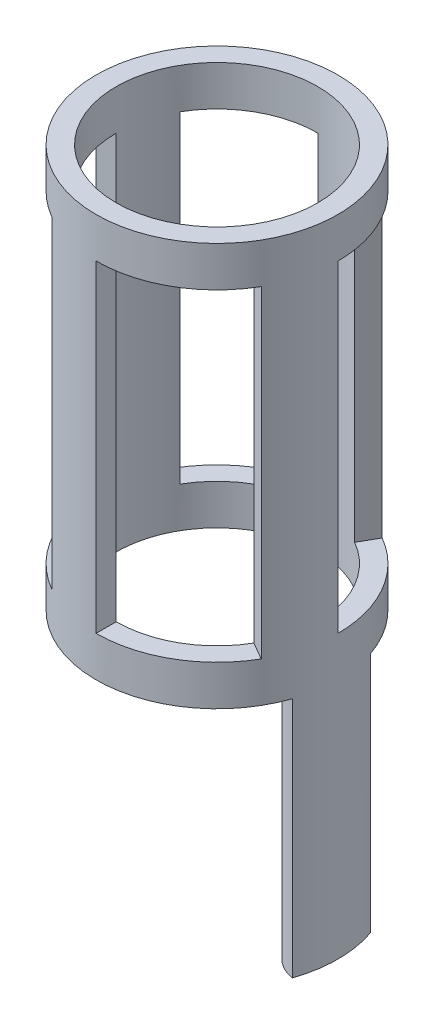
ISO-10303-21;
HEADER;
FILE_DESCRIPTION(('STEP AP214'),'2;1');
FILE_NAME('part.step','',(''),(''),'','','');
FILE_SCHEMA(('AUTOMOTIVE_DESIGN { 1 0 10303 214 1 1 1 1 }'));
ENDSEC;
DATA;
#1=APPLICATION_CONTEXT('core data for automotive mechanical design processes');
#2=APPLICATION_PROTOCOL_DEFINITION('international standard','automotive_design',2000,#1);
#3=PRODUCT_CONTEXT('',#1,'mechanical');
#4=PRODUCT('Part','Part','',(#3));
#5=PRODUCT_RELATED_PRODUCT_CATEGORY('part','',(#4));
#6=PRODUCT_DEFINITION_FORMATION('','',#4);
#7=PRODUCT_DEFINITION_CONTEXT('part definition',#1,'design');
#8=PRODUCT_DEFINITION('design','',#6,#7);
#9=PRODUCT_DEFINITION_SHAPE('','',#8);
#10=(LENGTH_UNIT() NAMED_UNIT(*) SI_UNIT(.MILLI.,.METRE.));
#11=(NAMED_UNIT(*) PLANE_ANGLE_UNIT() SI_UNIT($,.RADIAN.));
#12=(NAMED_UNIT(*) SI_UNIT($,.STERADIAN.) SOLID_ANGLE_UNIT());
#13=UNCERTAINTY_MEASURE_WITH_UNIT(LENGTH_MEASURE(1.E-05),#10,'distance_accuracy_value','');
#14=(GEOMETRIC_REPRESENTATION_CONTEXT(3) GLOBAL_UNCERTAINTY_ASSIGNED_CONTEXT((#13)) GLOBAL_UNIT_ASSIGNED_CONTEXT((#10,
#11,#12)) REPRESENTATION_CONTEXT('',''));
#15=CARTESIAN_POINT('',(0.,0.,0.));
#16=DIRECTION('',(0.,0.,1.));
#17=DIRECTION('',(1.,0.,0.));
#18=AXIS2_PLACEMENT_3D('',#15,#16,#17);
#19=CARTESIAN_POINT('',(0.,0.,0.));
#20=DIRECTION('',(0.,1.,0.));
#21=DIRECTION('',(0.,0.,1.));
#22=AXIS2_PLACEMENT_3D('',#19,#20,#21);
#23=PLANE('',#22);
#24=CARTESIAN_POINT('',(0.,0.,0.));
#25=DIRECTION('',(0.,-1.,0.));
#26=DIRECTION('',(0.,0.,-1.));
#27=AXIS2_PLACEMENT_3D('',#24,#25,#26);
#28=CIRCLE('',#27,35.6);
#29=CARTESIAN_POINT('',(34.3696850393701,0.,-9.27818679993567));
#30=VERTEX_POINT('',#29);
#31=CARTESIAN_POINT('',(34.3696850393701,0.,9.27818679993567));
#32=VERTEX_POINT('',#31);
#33=EDGE_CURVE('E51',#30,#32,#28,.T.);
#34=ORIENTED_EDGE('',*,*,#33,.T.);
#35=CARTESIAN_POINT('',(38.1,0.,0.));
#36=DIRECTION('',(0.,-1.,0.));
#37=DIRECTION('',(0.,0.,-1.));
#38=AXIS2_PLACEMENT_3D('',#35,#36,#37);
#39=CIRCLE('',#38,10.);
#40=CARTESIAN_POINT('',(30.9668307086614,0.,7.00841607362921));
#41=VERTEX_POINT('',#40);
#42=EDGE_CURVE('E44',#32,#41,#39,.T.);
#43=ORIENTED_EDGE('',*,*,#42,.T.);
#44=CARTESIAN_POINT('',(0.,0.,0.));
#45=DIRECTION('',(0.,1.,0.));
#46=DIRECTION('',(0.,0.,1.));
#47=AXIS2_PLACEMENT_3D('',#44,#45,#46);
#48=CIRCLE('',#47,31.75);
#49=CARTESIAN_POINT('',(30.9668307086614,0.,-7.00841607362921));
#50=VERTEX_POINT('',#49);
#51=EDGE_CURVE('E327',#41,#50,#48,.T.);
#52=ORIENTED_EDGE('',*,*,#51,.T.);
#53=EDGE_CURVE('E11',#50,#30,#39,.T.);
#54=ORIENTED_EDGE('',*,*,#53,.T.);
#55=EDGE_LOOP('',(#34,#43,#52,#54));
#56=FACE_BOUND('',#55,.T.);
#57=ADVANCED_FACE('F33',(#56),#23,.F.);
#58=CARTESIAN_POINT('',(0.,127.,0.));
#59=DIRECTION('',(0.866025403784438,0.,0.5));
#60=DIRECTION('',(0.5,0.,-0.866025403784438));
#61=AXIS2_PLACEMENT_3D('',#58,#59,#60);
#62=PLANE('',#61);
#63=DIRECTION('',(-0.5,0.,0.866025403784438));
#64=VECTOR('',#63,1.);
#65=CARTESIAN_POINT('',(0.,114.3,0.));
#66=LINE('',#65,#64);
#67=CARTESIAN_POINT('',(-15.875,114.3,27.4963065701559));
#68=VERTEX_POINT('',#67);
#69=CARTESIAN_POINT('',(-19.0500000000001,114.3,32.9955678841871));
#70=VERTEX_POINT('',#69);
#71=EDGE_CURVE('E247',#68,#70,#66,.T.);
#72=ORIENTED_EDGE('',*,*,#71,.F.);
#73=DIRECTION('',(0.,-1.,0.));
#74=VECTOR('',#73,1.);
#75=CARTESIAN_POINT('',(-15.875,127.,27.4963065701559));
#76=LINE('',#75,#74);
#77=CARTESIAN_POINT('',(-15.875,12.7,27.4963065701559));
#78=VERTEX_POINT('',#77);
#79=EDGE_CURVE('E304',#68,#78,#76,.T.);
#80=ORIENTED_EDGE('',*,*,#79,.T.);
#81=DIRECTION('',(0.5,0.,-0.866025403784438));
#82=VECTOR('',#81,1.);
#83=CARTESIAN_POINT('',(0.,12.7,0.));
#84=LINE('',#83,#82);
#85=CARTESIAN_POINT('',(-19.0500000000001,12.7,32.9955678841871));
#86=VERTEX_POINT('',#85);
#87=EDGE_CURVE('E309',#86,#78,#84,.T.);
#88=ORIENTED_EDGE('',*,*,#87,.F.);
#89=DIRECTION('',(0.,-1.,0.));
#90=VECTOR('',#89,1.);
#91=CARTESIAN_POINT('',(-19.0500000000001,127.,32.9955678841871));
#92=LINE('',#91,#90);
#93=EDGE_CURVE('E302',#70,#86,#92,.T.);
#94=ORIENTED_EDGE('',*,*,#93,.F.);
#95=EDGE_LOOP('',(#72,#80,#88,#94));
#96=FACE_BOUND('',#95,.T.);
#97=ADVANCED_FACE('F365',(#96),#62,.F.);
#98=CARTESIAN_POINT('',(0.,127.,0.));
#99=DIRECTION('',(-1.,0.,0.));
#100=DIRECTION('',(0.,0.,1.));
#101=AXIS2_PLACEMENT_3D('',#98,#99,#100);
#102=PLANE('',#101);
#103=DIRECTION('',(0.,0.,-1.));
#104=VECTOR('',#103,1.);
#105=CARTESIAN_POINT('',(0.,114.3,0.));
#106=LINE('',#105,#104);
#107=CARTESIAN_POINT('',(0.,114.3,38.1));
#108=VERTEX_POINT('',#107);
#109=CARTESIAN_POINT('',(0.,114.3,31.75));
#110=VERTEX_POINT('',#109);
#111=EDGE_CURVE('E244',#108,#110,#106,.T.);
#112=ORIENTED_EDGE('',*,*,#111,.F.);
#113=DIRECTION('',(0.,-1.,0.));
#114=VECTOR('',#113,1.);
#115=CARTESIAN_POINT('',(0.,127.,38.1));
#116=LINE('',#115,#114);
#117=CARTESIAN_POINT('',(0.,12.7,38.1));
#118=VERTEX_POINT('',#117);
#119=EDGE_CURVE('E300',#108,#118,#116,.T.);
#120=ORIENTED_EDGE('',*,*,#119,.T.);
#121=DIRECTION('',(0.,0.,1.));
#122=VECTOR('',#121,1.);
#123=CARTESIAN_POINT('',(0.,12.7,0.));
#124=LINE('',#123,#122);
#125=CARTESIAN_POINT('',(0.,12.7,31.75));
#126=VERTEX_POINT('',#125);
#127=EDGE_CURVE('E306',#126,#118,#124,.T.);
#128=ORIENTED_EDGE('',*,*,#127,.F.);
#129=DIRECTION('',(0.,-1.,0.));
#130=VECTOR('',#129,1.);
#131=CARTESIAN_POINT('',(0.,127.,31.75));
#132=LINE('',#131,#130);
#133=EDGE_CURVE('E298',#110,#126,#132,.T.);
#134=ORIENTED_EDGE('',*,*,#133,.F.);
#135=EDGE_LOOP('',(#112,#120,#128,#134));
#136=FACE_BOUND('',#135,.T.);
#137=ADVANCED_FACE('F425',(#136),#102,.F.);
#138=CARTESIAN_POINT('',(0.,127.,0.));
#139=DIRECTION('',(0.500000000000001,0.,-0.866025403784438));
#140=DIRECTION('',(-0.866025403784438,0.,-0.500000000000001));
#141=AXIS2_PLACEMENT_3D('',#138,#139,#140);
#142=PLANE('',#141);
#143=DIRECTION('',(0.866025403784438,0.,0.500000000000001));
#144=VECTOR('',#143,1.);
#145=CARTESIAN_POINT('',(0.,114.3,0.));
#146=LINE('',#145,#144);
#147=CARTESIAN_POINT('',(27.4963065701559,114.3,15.875));
#148=VERTEX_POINT('',#147);
#149=CARTESIAN_POINT('',(32.9955678841871,114.3,19.05));
#150=VERTEX_POINT('',#149);
#151=EDGE_CURVE('E241',#148,#150,#146,.T.);
#152=ORIENTED_EDGE('',*,*,#151,.F.);
#153=DIRECTION('',(0.,-1.,0.));
#154=VECTOR('',#153,1.);
#155=CARTESIAN_POINT('',(27.4963065701559,127.,15.875));
#156=LINE('',#155,#154);
#157=CARTESIAN_POINT('',(27.4963065701559,12.7,15.875));
#158=VERTEX_POINT('',#157);
#159=EDGE_CURVE('E284',#148,#158,#156,.T.);
#160=ORIENTED_EDGE('',*,*,#159,.T.);
#161=DIRECTION('',(-0.866025403784438,0.,-0.500000000000001));
#162=VECTOR('',#161,1.);
#163=CARTESIAN_POINT('',(0.,12.7,0.));
#164=LINE('',#163,#162);
#165=CARTESIAN_POINT('',(32.9955678841871,12.7,19.05));
#166=VERTEX_POINT('',#165);
#167=EDGE_CURVE('E289',#166,#158,#164,.T.);
#168=ORIENTED_EDGE('',*,*,#167,.F.);
#169=DIRECTION('',(0.,-1.,0.));
#170=VECTOR('',#169,1.);
#171=CARTESIAN_POINT('',(32.9955678841871,127.,19.05));
#172=LINE('',#171,#170);
#173=EDGE_CURVE('E282',#150,#166,#172,.T.);
#174=ORIENTED_EDGE('',*,*,#173,.F.);
#175=EDGE_LOOP('',(#152,#160,#168,#174));
#176=FACE_BOUND('',#175,.T.);
#177=ADVANCED_FACE('F466',(#176),#142,.F.);
#178=CARTESIAN_POINT('',(0.,127.,0.));
#179=DIRECTION('',(0.,0.,-1.));
#180=DIRECTION('',(-1.,0.,0.));
#181=AXIS2_PLACEMENT_3D('',#178,#179,#180);
#182=PLANE('',#181);
#183=DIRECTION('',(0.,-1.,0.));
#184=VECTOR('',#183,1.);
#185=CARTESIAN_POINT('',(31.75,127.,0.));
#186=LINE('',#185,#184);
#187=CARTESIAN_POINT('',(31.75,114.3,0.));
#188=VERTEX_POINT('',#187);
#189=CARTESIAN_POINT('',(31.75,12.7,0.));
#190=VERTEX_POINT('',#189);
#191=EDGE_CURVE('E278',#188,#190,#186,.T.);
#192=ORIENTED_EDGE('',*,*,#191,.F.);
#193=DIRECTION('',(1.,0.,0.));
#194=VECTOR('',#193,1.);
#195=CARTESIAN_POINT('',(0.,114.3,0.));
#196=LINE('',#195,#194);
#197=CARTESIAN_POINT('',(38.1,114.3,0.));
#198=VERTEX_POINT('',#197);
#199=EDGE_CURVE('E238',#188,#198,#196,.T.);
#200=ORIENTED_EDGE('',*,*,#199,.T.);
#201=DIRECTION('',(0.,-1.,0.));
#202=VECTOR('',#201,1.);
#203=CARTESIAN_POINT('',(38.1,127.,0.));
#204=LINE('',#203,#202);
#205=CARTESIAN_POINT('',(38.1,12.7,0.));
#206=VERTEX_POINT('',#205);
#207=EDGE_CURVE('E280',#198,#206,#204,.T.);
#208=ORIENTED_EDGE('',*,*,#207,.T.);
#209=DIRECTION('',(-1.,0.,0.));
#210=VECTOR('',#209,1.);
#211=CARTESIAN_POINT('',(0.,12.7,0.));
#212=LINE('',#211,#210);
#213=EDGE_CURVE('E286',#206,#190,#212,.T.);
#214=ORIENTED_EDGE('',*,*,#213,.T.);
#215=EDGE_LOOP('',(#192,#200,#208,#214));
#216=FACE_BOUND('',#215,.T.);
#217=ADVANCED_FACE('F386',(#216),#182,.T.);
#218=CARTESIAN_POINT('',(0.,127.,0.));
#219=DIRECTION('',(-0.866025403784438,0.,-0.5));
#220=DIRECTION('',(-0.5,0.,0.866025403784438));
#221=AXIS2_PLACEMENT_3D('',#218,#219,#220);
#222=PLANE('',#221);
#223=DIRECTION('',(0.5,0.,-0.866025403784438));
#224=VECTOR('',#223,1.);
#225=CARTESIAN_POINT('',(0.,114.3,0.));
#226=LINE('',#225,#224);
#227=CARTESIAN_POINT('',(15.875,114.3,-27.4963065701559));
#228=VERTEX_POINT('',#227);
#229=CARTESIAN_POINT('',(19.05,114.3,-32.9955678841871));
#230=VERTEX_POINT('',#229);
#231=EDGE_CURVE('E235',#228,#230,#226,.T.);
#232=ORIENTED_EDGE('',*,*,#231,.F.);
#233=DIRECTION('',(0.,-1.,0.));
#234=VECTOR('',#233,1.);
#235=CARTESIAN_POINT('',(15.875,127.,-27.4963065701559));
#236=LINE('',#235,#234);
#237=CARTESIAN_POINT('',(15.875,12.7,-27.4963065701559));
#238=VERTEX_POINT('',#237);
#239=EDGE_CURVE('E270',#228,#238,#236,.T.);
#240=ORIENTED_EDGE('',*,*,#239,.T.);
#241=DIRECTION('',(-0.5,0.,0.866025403784438));
#242=VECTOR('',#241,1.);
#243=CARTESIAN_POINT('',(0.,12.7,0.));
#244=LINE('',#243,#242);
#245=CARTESIAN_POINT('',(19.05,12.7,-32.9955678841871));
#246=VERTEX_POINT('',#245);
#247=EDGE_CURVE('E275',#246,#238,#244,.T.);
#248=ORIENTED_EDGE('',*,*,#247,.F.);
#249=DIRECTION('',(0.,-1.,0.));
#250=VECTOR('',#249,1.);
#251=CARTESIAN_POINT('',(19.05,127.,-32.9955678841871));
#252=LINE('',#251,#250);
#253=EDGE_CURVE('E268',#230,#246,#252,.T.);
#254=ORIENTED_EDGE('',*,*,#253,.F.);
#255=EDGE_LOOP('',(#232,#240,#248,#254));
#256=FACE_BOUND('',#255,.T.);
#257=ADVANCED_FACE('F460',(#256),#222,.F.);
#258=CARTESIAN_POINT('',(0.,127.,0.));
#259=DIRECTION('',(-1.,0.,0.));
#260=DIRECTION('',(0.,0.,1.));
#261=AXIS2_PLACEMENT_3D('',#258,#259,#260);
#262=PLANE('',#261);
#263=DIRECTION('',(0.,-1.,0.));
#264=VECTOR('',#263,1.);
#265=CARTESIAN_POINT('',(0.,127.,-31.75));
#266=LINE('',#265,#264);
#267=CARTESIAN_POINT('',(0.,114.3,-31.75));
#268=VERTEX_POINT('',#267);
#269=CARTESIAN_POINT('',(0.,12.7,-31.75));
#270=VERTEX_POINT('',#269);
#271=EDGE_CURVE('E264',#268,#270,#266,.T.);
#272=ORIENTED_EDGE('',*,*,#271,.F.);
#273=DIRECTION('',(0.,0.,-1.));
#274=VECTOR('',#273,1.);
#275=CARTESIAN_POINT('',(0.,114.3,0.));
#276=LINE('',#275,#274);
#277=CARTESIAN_POINT('',(0.,114.3,-38.1));
#278=VERTEX_POINT('',#277);
#279=EDGE_CURVE('E232',#268,#278,#276,.T.);
#280=ORIENTED_EDGE('',*,*,#279,.T.);
#281=DIRECTION('',(0.,-1.,0.));
#282=VECTOR('',#281,1.);
#283=CARTESIAN_POINT('',(0.,127.,-38.1));
#284=LINE('',#283,#282);
#285=CARTESIAN_POINT('',(0.,12.7,-38.1));
#286=VERTEX_POINT('',#285);
#287=EDGE_CURVE('E266',#278,#286,#284,.T.);
#288=ORIENTED_EDGE('',*,*,#287,.T.);
#289=DIRECTION('',(0.,0.,1.));
#290=VECTOR('',#289,1.);
#291=CARTESIAN_POINT('',(0.,12.7,0.));
#292=LINE('',#291,#290);
#293=EDGE_CURVE('E272',#286,#270,#292,.T.);
#294=ORIENTED_EDGE('',*,*,#293,.T.);
#295=EDGE_LOOP('',(#272,#280,#288,#294));
#296=FACE_BOUND('',#295,.T.);
#297=ADVANCED_FACE('F411',(#296),#262,.T.);
#298=CARTESIAN_POINT('',(0.,127.,0.));
#299=DIRECTION('',(-0.500000000000001,0.,0.866025403784438));
#300=DIRECTION('',(0.866025403784438,0.,0.500000000000001));
#301=AXIS2_PLACEMENT_3D('',#298,#299,#300);
#302=PLANE('',#301);
#303=DIRECTION('',(-0.866025403784438,0.,-0.500000000000001));
#304=VECTOR('',#303,1.);
#305=CARTESIAN_POINT('',(0.,114.3,0.));
#306=LINE('',#305,#304);
#307=CARTESIAN_POINT('',(-27.4963065701559,114.3,-15.875));
#308=VERTEX_POINT('',#307);
#309=CARTESIAN_POINT('',(-32.9955678841871,114.3,-19.05));
#310=VERTEX_POINT('',#309);
#311=EDGE_CURVE('E228',#308,#310,#306,.T.);
#312=ORIENTED_EDGE('',*,*,#311,.F.);
#313=DIRECTION('',(0.,-1.,0.));
#314=VECTOR('',#313,1.);
#315=CARTESIAN_POINT('',(-27.4963065701559,127.,-15.875));
#316=LINE('',#315,#314);
#317=CARTESIAN_POINT('',(-27.4963065701559,12.7,-15.875));
#318=VERTEX_POINT('',#317);
#319=EDGE_CURVE('E256',#308,#318,#316,.T.);
#320=ORIENTED_EDGE('',*,*,#319,.T.);
#321=DIRECTION('',(0.866025403784438,0.,0.500000000000001));
#322=VECTOR('',#321,1.);
#323=CARTESIAN_POINT('',(0.,12.7,0.));
#324=LINE('',#323,#322);
#325=CARTESIAN_POINT('',(-32.9955678841871,12.7,-19.05));
#326=VERTEX_POINT('',#325);
#327=EDGE_CURVE('E261',#326,#318,#324,.T.);
#328=ORIENTED_EDGE('',*,*,#327,.F.);
#329=DIRECTION('',(0.,-1.,0.));
#330=VECTOR('',#329,1.);
#331=CARTESIAN_POINT('',(-32.9955678841871,127.,-19.05));
#332=LINE('',#331,#330);
#333=EDGE_CURVE('E254',#310,#326,#332,.T.);
#334=ORIENTED_EDGE('',*,*,#333,.F.);
#335=EDGE_LOOP('',(#312,#320,#328,#334));
#336=FACE_BOUND('',#335,.T.);
#337=ADVANCED_FACE('F401',(#336),#302,.F.);
#338=CARTESIAN_POINT('',(0.,127.,0.));
#339=DIRECTION('',(0.,0.,1.));
#340=DIRECTION('',(1.,0.,0.));
#341=AXIS2_PLACEMENT_3D('',#338,#339,#340);
#342=PLANE('',#341);
#343=DIRECTION('',(0.,-1.,0.));
#344=VECTOR('',#343,1.);
#345=CARTESIAN_POINT('',(-31.75,127.,0.));
#346=LINE('',#345,#344);
#347=CARTESIAN_POINT('',(-31.75,114.3,0.));
#348=VERTEX_POINT('',#347);
#349=CARTESIAN_POINT('',(-31.75,12.7,0.));
#350=VERTEX_POINT('',#349);
#351=EDGE_CURVE('E250',#348,#350,#346,.T.);
#352=ORIENTED_EDGE('',*,*,#351,.F.);
#353=DIRECTION('',(-1.,0.,0.));
#354=VECTOR('',#353,1.);
#355=CARTESIAN_POINT('',(0.,114.3,0.));
#356=LINE('',#355,#354);
#357=CARTESIAN_POINT('',(-38.1,114.3,0.));
#358=VERTEX_POINT('',#357);
#359=EDGE_CURVE('E37',#348,#358,#356,.T.);
#360=ORIENTED_EDGE('',*,*,#359,.T.);
#361=DIRECTION('',(0.,-1.,0.));
#362=VECTOR('',#361,1.);
#363=CARTESIAN_POINT('',(-38.1,127.,0.));
#364=LINE('',#363,#362);
#365=CARTESIAN_POINT('',(-38.1,12.7,0.));
#366=VERTEX_POINT('',#365);
#367=EDGE_CURVE('E252',#358,#366,#364,.T.);
#368=ORIENTED_EDGE('',*,*,#367,.T.);
#369=DIRECTION('',(1.,0.,0.));
#370=VECTOR('',#369,1.);
#371=CARTESIAN_POINT('',(0.,12.7,0.));
#372=LINE('',#371,#370);
#373=EDGE_CURVE('E258',#366,#350,#372,.T.);
#374=ORIENTED_EDGE('',*,*,#373,.T.);
#375=EDGE_LOOP('',(#352,#360,#368,#374));
#376=FACE_BOUND('',#375,.T.);
#377=ADVANCED_FACE('F351',(#376),#342,.T.);
#378=CARTESIAN_POINT('',(0.,12.7,0.));
#379=DIRECTION('',(0.,1.,0.));
#380=DIRECTION('',(0.,0.,1.));
#381=AXIS2_PLACEMENT_3D('',#378,#379,#380);
#382=PLANE('',#381);
#383=CARTESIAN_POINT('',(0.,12.7,0.));
#384=DIRECTION('',(0.,1.,0.));
#385=DIRECTION('',(0.,0.,1.));
#386=AXIS2_PLACEMENT_3D('',#383,#384,#385);
#387=CIRCLE('',#386,38.1);
#388=EDGE_CURVE('E333',#286,#326,#387,.T.);
#389=ORIENTED_EDGE('',*,*,#388,.T.);
#390=ORIENTED_EDGE('',*,*,#327,.T.);
#391=CARTESIAN_POINT('',(0.,12.7,0.));
#392=DIRECTION('',(0.,1.,0.));
#393=DIRECTION('',(0.,0.,1.));
#394=AXIS2_PLACEMENT_3D('',#391,#392,#393);
#395=CIRCLE('',#394,31.75);
#396=EDGE_CURVE('E370',#270,#318,#395,.T.);
#397=ORIENTED_EDGE('',*,*,#396,.F.);
#398=ORIENTED_EDGE('',*,*,#293,.F.);
#399=EDGE_LOOP('',(#389,#390,#397,#398));
#400=FACE_BOUND('',#399,.T.);
#401=ADVANCED_FACE('F397',(#400),#382,.T.);
#402=EDGE_CURVE('E317',#206,#246,#387,.T.);
#403=ORIENTED_EDGE('',*,*,#402,.T.);
#404=ORIENTED_EDGE('',*,*,#247,.T.);
#405=EDGE_CURVE('E322',#190,#238,#395,.T.);
#406=ORIENTED_EDGE('',*,*,#405,.F.);
#407=ORIENTED_EDGE('',*,*,#213,.F.);
#408=EDGE_LOOP('',(#403,#404,#406,#407));
#409=FACE_BOUND('',#408,.T.);
#410=ADVANCED_FACE('F382',(#409),#382,.T.);
#411=EDGE_CURVE('E313',#118,#166,#387,.T.);
#412=ORIENTED_EDGE('',*,*,#411,.T.);
#413=ORIENTED_EDGE('',*,*,#167,.T.);
#414=EDGE_CURVE('E319',#126,#158,#395,.T.);
#415=ORIENTED_EDGE('',*,*,#414,.F.);
#416=ORIENTED_EDGE('',*,*,#127,.T.);
#417=EDGE_LOOP('',(#412,#413,#415,#416));
#418=FACE_BOUND('',#417,.T.);
#419=ADVANCED_FACE('F418',(#418),#382,.T.);
#420=ORIENTED_EDGE('',*,*,#373,.F.);
#421=EDGE_CURVE('E318',#366,#86,#387,.T.);
#422=ORIENTED_EDGE('',*,*,#421,.T.);
#423=ORIENTED_EDGE('',*,*,#87,.T.);
#424=EDGE_CURVE('E316',#350,#78,#395,.T.);
#425=ORIENTED_EDGE('',*,*,#424,.F.);
#426=EDGE_LOOP('',(#420,#422,#423,#425));
#427=FACE_BOUND('',#426,.T.);
#428=ADVANCED_FACE('F361',(#427),#382,.T.);
#429=CARTESIAN_POINT('',(0.,12.7,0.));
#430=DIRECTION('',(0.,-1.,0.));
#431=DIRECTION('',(0.,0.,-1.));
#432=AXIS2_PLACEMENT_3D('',#429,#430,#431);
#433=CYLINDRICAL_SURFACE('',#432,38.1);
#434=ORIENTED_EDGE('',*,*,#207,.F.);
#435=CARTESIAN_POINT('',(0.,114.3,0.));
#436=DIRECTION('',(0.,1.,0.));
#437=DIRECTION('',(0.,0.,1.));
#438=AXIS2_PLACEMENT_3D('',#435,#436,#437);
#439=CIRCLE('',#438,38.1);
#440=EDGE_CURVE('E229',#198,#230,#439,.T.);
#441=ORIENTED_EDGE('',*,*,#440,.T.);
#442=ORIENTED_EDGE('',*,*,#253,.T.);
#443=ORIENTED_EDGE('',*,*,#402,.F.);
#444=EDGE_LOOP('',(#434,#441,#442,#443));
#445=FACE_BOUND('',#444,.T.);
#446=ORIENTED_EDGE('',*,*,#287,.F.);
#447=EDGE_CURVE('E409',#278,#310,#439,.T.);
#448=ORIENTED_EDGE('',*,*,#447,.T.);
#449=ORIENTED_EDGE('',*,*,#333,.T.);
#450=ORIENTED_EDGE('',*,*,#388,.F.);
#451=EDGE_LOOP('',(#446,#448,#449,#450));
#452=FACE_BOUND('',#451,.T.);
#453=ORIENTED_EDGE('',*,*,#367,.F.);
#454=EDGE_CURVE('E223',#358,#70,#439,.T.);
#455=ORIENTED_EDGE('',*,*,#454,.T.);
#456=ORIENTED_EDGE('',*,*,#93,.T.);
#457=ORIENTED_EDGE('',*,*,#421,.F.);
#458=EDGE_LOOP('',(#453,#455,#456,#457));
#459=FACE_BOUND('',#458,.T.);
#460=EDGE_CURVE('E225',#108,#150,#439,.T.);
#461=ORIENTED_EDGE('',*,*,#460,.T.);
#462=ORIENTED_EDGE('',*,*,#173,.T.);
#463=ORIENTED_EDGE('',*,*,#411,.F.);
#464=ORIENTED_EDGE('',*,*,#119,.F.);
#465=EDGE_LOOP('',(#461,#462,#463,#464));
#466=FACE_BOUND('',#465,.T.);
#467=CARTESIAN_POINT('',(0.,127.,0.));
#468=DIRECTION('',(0.,1.,0.));
#469=DIRECTION('',(0.,0.,1.));
#470=AXIS2_PLACEMENT_3D('',#467,#468,#469);
#471=CIRCLE('',#470,38.1);
#472=CARTESIAN_POINT('',(0.,127.,38.1));
#473=VERTEX_POINT('',#472);
#474=EDGE_CURVE('E295',#473,#473,#471,.T.);
#475=ORIENTED_EDGE('',*,*,#474,.F.);
#476=EDGE_LOOP('',(#475));
#477=FACE_BOUND('',#476,.T.);
#478=CARTESIAN_POINT('',(0.,0.,0.));
#479=DIRECTION('',(0.,1.,0.));
#480=DIRECTION('',(0.,0.,1.));
#481=AXIS2_PLACEMENT_3D('',#478,#479,#480);
#482=CIRCLE('',#481,38.1);
#483=CARTESIAN_POINT('',(36.0494750656168,0.,-12.3306669524999));
#484=VERTEX_POINT('',#483);
#485=CARTESIAN_POINT('',(36.0494750656168,0.,12.3306669524999));
#486=VERTEX_POINT('',#485);
#487=EDGE_CURVE('E312',#484,#486,#482,.T.);
#488=ORIENTED_EDGE('',*,*,#487,.T.);
#489=DIRECTION('',(0.,1.,0.));
#490=VECTOR('',#489,1.);
#491=CARTESIAN_POINT('',(36.0494750656168,-76.2,12.3306669524999));
#492=LINE('',#491,#490);
#493=CARTESIAN_POINT('',(36.0494750656168,-76.2,12.3306669524999));
#494=VERTEX_POINT('',#493);
#495=EDGE_CURVE('E215',#494,#486,#492,.T.);
#496=ORIENTED_EDGE('',*,*,#495,.F.);
#497=CARTESIAN_POINT('',(0.,-76.2,0.));
#498=DIRECTION('',(0.,-1.,0.));
#499=DIRECTION('',(0.,0.,-1.));
#500=AXIS2_PLACEMENT_3D('',#497,#498,#499);
#501=CIRCLE('',#500,38.1);
#502=CARTESIAN_POINT('',(36.0494750656168,-76.2,-12.3306669524999));
#503=VERTEX_POINT('',#502);
#504=EDGE_CURVE('E202',#503,#494,#501,.T.);
#505=ORIENTED_EDGE('',*,*,#504,.F.);
#506=DIRECTION('',(0.,1.,0.));
#507=VECTOR('',#506,1.);
#508=CARTESIAN_POINT('',(36.0494750656168,-76.2,-12.3306669524999));
#509=LINE('',#508,#507);
#510=EDGE_CURVE('E192',#503,#484,#509,.T.);
#511=ORIENTED_EDGE('',*,*,#510,.T.);
#512=EDGE_LOOP('',(#488,#496,#505,#511));
#513=FACE_BOUND('',#512,.T.);
#514=ADVANCED_FACE('F35',(#445,#452,#459,#466,#477,#513),#433,.T.);
#515=CARTESIAN_POINT('',(0.,12.7,0.));
#516=DIRECTION('',(0.,-1.,0.));
#517=DIRECTION('',(0.,0.,-1.));
#518=AXIS2_PLACEMENT_3D('',#515,#516,#517);
#519=CYLINDRICAL_SURFACE('',#518,31.75);
#520=CARTESIAN_POINT('',(0.,114.3,0.));
#521=DIRECTION('',(0.,1.,0.));
#522=DIRECTION('',(0.,0.,1.));
#523=AXIS2_PLACEMENT_3D('',#520,#521,#522);
#524=CIRCLE('',#523,31.75);
#525=EDGE_CURVE('E224',#188,#228,#524,.T.);
#526=ORIENTED_EDGE('',*,*,#525,.F.);
#527=ORIENTED_EDGE('',*,*,#191,.T.);
#528=ORIENTED_EDGE('',*,*,#405,.T.);
#529=ORIENTED_EDGE('',*,*,#239,.F.);
#530=EDGE_LOOP('',(#526,#527,#528,#529));
#531=FACE_BOUND('',#530,.T.);
#532=EDGE_CURVE('E403',#268,#308,#524,.T.);
#533=ORIENTED_EDGE('',*,*,#532,.F.);
#534=ORIENTED_EDGE('',*,*,#271,.T.);
#535=ORIENTED_EDGE('',*,*,#396,.T.);
#536=ORIENTED_EDGE('',*,*,#319,.F.);
#537=EDGE_LOOP('',(#533,#534,#535,#536));
#538=FACE_BOUND('',#537,.T.);
#539=EDGE_CURVE('E218',#348,#68,#524,.T.);
#540=ORIENTED_EDGE('',*,*,#539,.F.);
#541=ORIENTED_EDGE('',*,*,#351,.T.);
#542=ORIENTED_EDGE('',*,*,#424,.T.);
#543=ORIENTED_EDGE('',*,*,#79,.F.);
#544=EDGE_LOOP('',(#540,#541,#542,#543));
#545=FACE_BOUND('',#544,.T.);
#546=EDGE_CURVE('E220',#110,#148,#524,.T.);
#547=ORIENTED_EDGE('',*,*,#546,.F.);
#548=ORIENTED_EDGE('',*,*,#133,.T.);
#549=ORIENTED_EDGE('',*,*,#414,.T.);
#550=ORIENTED_EDGE('',*,*,#159,.F.);
#551=EDGE_LOOP('',(#547,#548,#549,#550));
#552=FACE_BOUND('',#551,.T.);
#553=CARTESIAN_POINT('',(0.,127.,0.));
#554=DIRECTION('',(0.,1.,0.));
#555=DIRECTION('',(0.,0.,1.));
#556=AXIS2_PLACEMENT_3D('',#553,#554,#555);
#557=CIRCLE('',#556,31.75);
#558=CARTESIAN_POINT('',(0.,127.,31.75));
#559=VERTEX_POINT('',#558);
#560=EDGE_CURVE('E292',#559,#559,#557,.T.);
#561=ORIENTED_EDGE('',*,*,#560,.T.);
#562=EDGE_LOOP('',(#561));
#563=FACE_BOUND('',#562,.T.);
#564=CARTESIAN_POINT('',(30.2286417322835,0.,9.71039232066608));
#565=VERTEX_POINT('',#564);
#566=EDGE_CURVE('E325',#565,#41,#48,.T.);
#567=ORIENTED_EDGE('',*,*,#566,.F.);
#568=CARTESIAN_POINT('',(30.2286417322835,0.,-9.71039232066608));
#569=VERTEX_POINT('',#568);
#570=EDGE_CURVE('E324',#569,#565,#48,.T.);
#571=ORIENTED_EDGE('',*,*,#570,.F.);
#572=EDGE_CURVE('E334',#50,#569,#48,.T.);
#573=ORIENTED_EDGE('',*,*,#572,.F.);
#574=ORIENTED_EDGE('',*,*,#51,.F.);
#575=EDGE_LOOP('',(#567,#571,#573,#574));
#576=FACE_BOUND('',#575,.T.);
#577=ADVANCED_FACE('F368',(#531,#538,#545,#552,#563,#576),#519,.F.);
#578=CARTESIAN_POINT('',(38.1,0.,0.));
#579=DIRECTION('',(0.,-1.,0.));
#580=DIRECTION('',(0.,0.,-1.));
#581=AXIS2_PLACEMENT_3D('',#578,#579,#580);
#582=CIRCLE('',#581,12.5);
#583=EDGE_CURVE('E199',#486,#565,#582,.T.);
#584=ORIENTED_EDGE('',*,*,#583,.F.);
#585=ORIENTED_EDGE('',*,*,#487,.F.);
#586=EDGE_CURVE('E42',#569,#484,#582,.T.);
#587=ORIENTED_EDGE('',*,*,#586,.F.);
#588=ORIENTED_EDGE('',*,*,#570,.T.);
#589=EDGE_LOOP('',(#584,#585,#587,#588));
#590=FACE_BOUND('',#589,.T.);
#591=ADVANCED_FACE('F417',(#590),#23,.F.);
#592=CARTESIAN_POINT('',(0.,127.,0.));
#593=DIRECTION('',(0.,1.,0.));
#594=DIRECTION('',(0.,0.,1.));
#595=AXIS2_PLACEMENT_3D('',#592,#593,#594);
#596=PLANE('',#595);
#597=ORIENTED_EDGE('',*,*,#474,.T.);
#598=EDGE_LOOP('',(#597));
#599=FACE_BOUND('',#598,.T.);
#600=ORIENTED_EDGE('',*,*,#560,.F.);
#601=EDGE_LOOP('',(#600));
#602=FACE_BOUND('',#601,.T.);
#603=ADVANCED_FACE('F428',(#599,#602),#596,.T.);
#604=CARTESIAN_POINT('',(0.,114.3,0.));
#605=DIRECTION('',(0.,1.,0.));
#606=DIRECTION('',(0.,0.,1.));
#607=AXIS2_PLACEMENT_3D('',#604,#605,#606);
#608=PLANE('',#607);
#609=ORIENTED_EDGE('',*,*,#539,.T.);
#610=ORIENTED_EDGE('',*,*,#71,.T.);
#611=ORIENTED_EDGE('',*,*,#454,.F.);
#612=ORIENTED_EDGE('',*,*,#359,.F.);
#613=EDGE_LOOP('',(#609,#610,#611,#612));
#614=FACE_BOUND('',#613,.T.);
#615=ADVANCED_FACE('F432',(#614),#608,.F.);
#616=ORIENTED_EDGE('',*,*,#279,.F.);
#617=ORIENTED_EDGE('',*,*,#532,.T.);
#618=ORIENTED_EDGE('',*,*,#311,.T.);
#619=ORIENTED_EDGE('',*,*,#447,.F.);
#620=EDGE_LOOP('',(#616,#617,#618,#619));
#621=FACE_BOUND('',#620,.T.);
#622=ADVANCED_FACE('F407',(#621),#608,.F.);
#623=ORIENTED_EDGE('',*,*,#199,.F.);
#624=ORIENTED_EDGE('',*,*,#525,.T.);
#625=ORIENTED_EDGE('',*,*,#231,.T.);
#626=ORIENTED_EDGE('',*,*,#440,.F.);
#627=EDGE_LOOP('',(#623,#624,#625,#626));
#628=FACE_BOUND('',#627,.T.);
#629=ADVANCED_FACE('F487',(#628),#608,.F.);
#630=ORIENTED_EDGE('',*,*,#460,.F.);
#631=ORIENTED_EDGE('',*,*,#111,.T.);
#632=ORIENTED_EDGE('',*,*,#546,.T.);
#633=ORIENTED_EDGE('',*,*,#151,.T.);
#634=EDGE_LOOP('',(#630,#631,#632,#633));
#635=FACE_BOUND('',#634,.T.);
#636=ADVANCED_FACE('F446',(#635),#608,.F.);
#637=CARTESIAN_POINT('',(0.,0.,0.));
#638=DIRECTION('',(0.,-1.,0.));
#639=DIRECTION('',(0.,0.,-1.));
#640=AXIS2_PLACEMENT_3D('',#637,#638,#639);
#641=PLANE('',#640);
#642=EDGE_CURVE('E210',#565,#569,#582,.T.);
#643=ORIENTED_EDGE('',*,*,#642,.F.);
#644=ORIENTED_EDGE('',*,*,#566,.T.);
#645=EDGE_CURVE('E45',#41,#50,#39,.T.);
#646=ORIENTED_EDGE('',*,*,#645,.T.);
#647=ORIENTED_EDGE('',*,*,#572,.T.);
#648=EDGE_LOOP('',(#643,#644,#646,#647));
#649=FACE_BOUND('',#648,.T.);
#650=ADVANCED_FACE('F339',(#649),#641,.F.);
#651=CARTESIAN_POINT('',(38.1,-76.2,0.));
#652=DIRECTION('',(0.,1.,0.));
#653=DIRECTION('',(0.,0.,1.));
#654=AXIS2_PLACEMENT_3D('',#651,#652,#653);
#655=CYLINDRICAL_SURFACE('',#654,10.);
#656=ORIENTED_EDGE('',*,*,#42,.F.);
#657=DIRECTION('',(0.,1.,0.));
#658=VECTOR('',#657,1.);
#659=CARTESIAN_POINT('',(34.3696850393701,-76.2,9.27818679993567));
#660=LINE('',#659,#658);
#661=CARTESIAN_POINT('',(34.3696850393701,-76.2,9.27818679993567));
#662=VERTEX_POINT('',#661);
#663=EDGE_CURVE('E184',#662,#32,#660,.T.);
#664=ORIENTED_EDGE('',*,*,#663,.F.);
#665=CARTESIAN_POINT('',(38.1,-76.2,0.));
#666=DIRECTION('',(0.,-1.,0.));
#667=DIRECTION('',(0.,0.,-1.));
#668=AXIS2_PLACEMENT_3D('',#665,#666,#667);
#669=CIRCLE('',#668,10.);
#670=CARTESIAN_POINT('',(34.3696850393701,-76.2,-9.27818679993567));
#671=VERTEX_POINT('',#670);
#672=EDGE_CURVE('E187',#662,#671,#669,.T.);
#673=ORIENTED_EDGE('',*,*,#672,.T.);
#674=DIRECTION('',(0.,1.,0.));
#675=VECTOR('',#674,1.);
#676=CARTESIAN_POINT('',(34.3696850393701,-76.2,-9.27818679993567));
#677=LINE('',#676,#675);
#678=EDGE_CURVE('E193',#671,#30,#677,.T.);
#679=ORIENTED_EDGE('',*,*,#678,.T.);
#680=ORIENTED_EDGE('',*,*,#53,.F.);
#681=ORIENTED_EDGE('',*,*,#645,.F.);
#682=EDGE_LOOP('',(#656,#664,#673,#679,#680,#681));
#683=FACE_BOUND('',#682,.T.);
#684=ADVANCED_FACE('F186',(#683),#655,.F.);
#685=CARTESIAN_POINT('',(0.,-76.2,0.));
#686=DIRECTION('',(0.,1.,0.));
#687=DIRECTION('',(0.,0.,1.));
#688=AXIS2_PLACEMENT_3D('',#685,#686,#687);
#689=CYLINDRICAL_SURFACE('',#688,35.6);
#690=ORIENTED_EDGE('',*,*,#33,.F.);
#691=ORIENTED_EDGE('',*,*,#678,.F.);
#692=CARTESIAN_POINT('',(0.,-76.2,0.));
#693=DIRECTION('',(0.,-1.,0.));
#694=DIRECTION('',(0.,0.,-1.));
#695=AXIS2_PLACEMENT_3D('',#692,#693,#694);
#696=CIRCLE('',#695,35.6);
#697=EDGE_CURVE('E198',#671,#662,#696,.T.);
#698=ORIENTED_EDGE('',*,*,#697,.T.);
#699=ORIENTED_EDGE('',*,*,#663,.T.);
#700=EDGE_LOOP('',(#690,#691,#698,#699));
#701=FACE_BOUND('',#700,.T.);
#702=ADVANCED_FACE('F201',(#701),#689,.F.);
#703=CARTESIAN_POINT('',(38.1,-76.2,0.));
#704=DIRECTION('',(0.,1.,0.));
#705=DIRECTION('',(0.,0.,1.));
#706=AXIS2_PLACEMENT_3D('',#703,#704,#705);
#707=CYLINDRICAL_SURFACE('',#706,12.5);
#708=ORIENTED_EDGE('',*,*,#583,.T.);
#709=ORIENTED_EDGE('',*,*,#642,.T.);
#710=ORIENTED_EDGE('',*,*,#586,.T.);
#711=ORIENTED_EDGE('',*,*,#510,.F.);
#712=CARTESIAN_POINT('',(38.1,-76.2,0.));
#713=DIRECTION('',(0.,-1.,0.));
#714=DIRECTION('',(0.,0.,-1.));
#715=AXIS2_PLACEMENT_3D('',#712,#713,#714);
#716=CIRCLE('',#715,12.5);
#717=EDGE_CURVE('E205',#494,#503,#716,.T.);
#718=ORIENTED_EDGE('',*,*,#717,.F.);
#719=ORIENTED_EDGE('',*,*,#495,.T.);
#720=EDGE_LOOP('',(#708,#709,#710,#711,#718,#719));
#721=FACE_BOUND('',#720,.T.);
#722=ADVANCED_FACE('F344',(#721),#707,.T.);
#723=CARTESIAN_POINT('',(0.,-76.2,0.));
#724=DIRECTION('',(0.,-1.,0.));
#725=DIRECTION('',(0.,0.,-1.));
#726=AXIS2_PLACEMENT_3D('',#723,#724,#725);
#727=PLANE('',#726);
#728=ORIENTED_EDGE('',*,*,#672,.F.);
#729=ORIENTED_EDGE('',*,*,#697,.F.);
#730=EDGE_LOOP('',(#728,#729));
#731=FACE_BOUND('',#730,.T.);
#732=ORIENTED_EDGE('',*,*,#504,.T.);
#733=ORIENTED_EDGE('',*,*,#717,.T.);
#734=EDGE_LOOP('',(#732,#733));
#735=FACE_BOUND('',#734,.T.);
#736=ADVANCED_FACE('F196',(#731,#735),#727,.T.);
#737=CLOSED_SHELL('',(#57,#97,#137,#177,#217,#257,#297,#337,#377,#401,#410,#419,#428,#514,#577,
#591,#603,#615,#622,#629,#636,#650,#684,#702,#722,#736));
#738=MANIFOLD_SOLID_BREP('B2',#737);
#739=ADVANCED_BREP_SHAPE_REPRESENTATION('',(#18,#738),#14);
#740=SHAPE_DEFINITION_REPRESENTATION(#9,#739);
ENDSEC;
END-ISO-10303-21;
